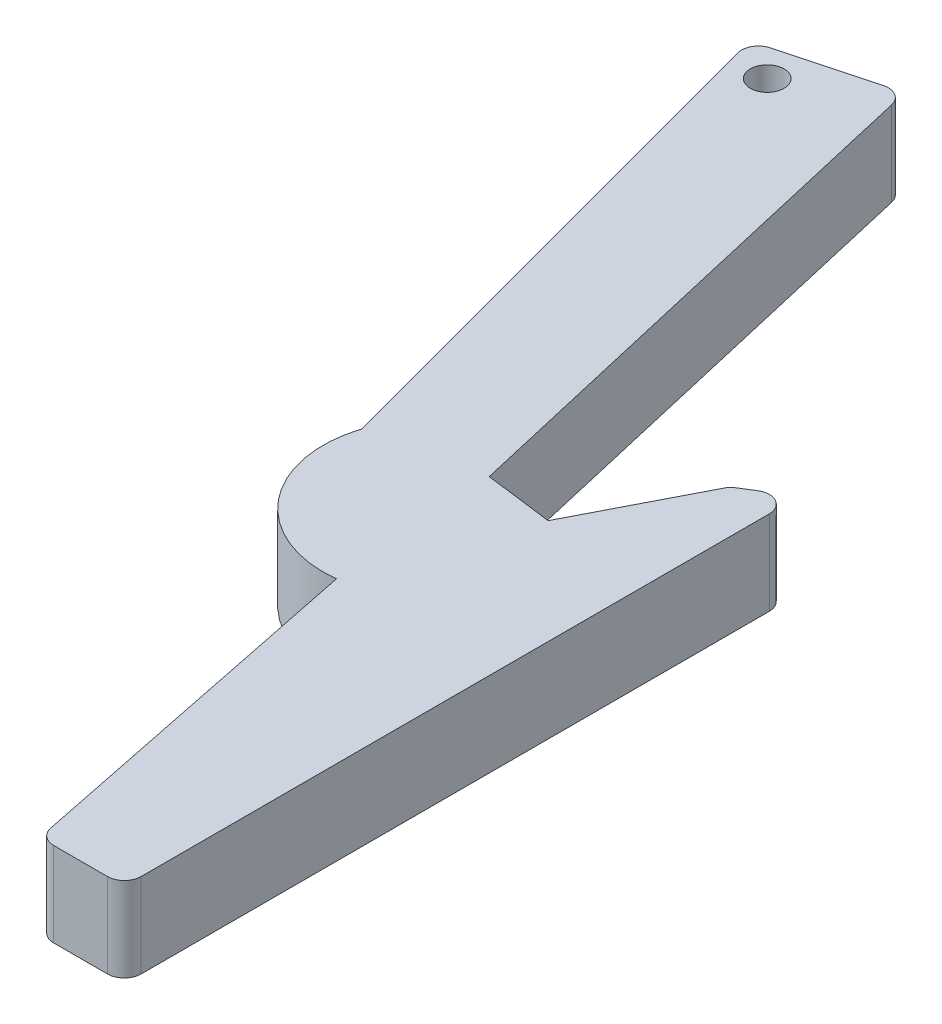
ISO-10303-21;
HEADER;
FILE_DESCRIPTION(('STEP AP214'),'2;1');
FILE_NAME('part.step','',(''),(''),'','','');
FILE_SCHEMA(('AUTOMOTIVE_DESIGN { 1 0 10303 214 1 1 1 1 }'));
ENDSEC;
DATA;
#1=APPLICATION_CONTEXT('core data for automotive mechanical design processes');
#2=APPLICATION_PROTOCOL_DEFINITION('international standard','automotive_design',2000,#1);
#3=PRODUCT_CONTEXT('',#1,'mechanical');
#4=PRODUCT('Part','Part','',(#3));
#5=PRODUCT_RELATED_PRODUCT_CATEGORY('part','',(#4));
#6=PRODUCT_DEFINITION_FORMATION('','',#4);
#7=PRODUCT_DEFINITION_CONTEXT('part definition',#1,'design');
#8=PRODUCT_DEFINITION('design','',#6,#7);
#9=PRODUCT_DEFINITION_SHAPE('','',#8);
#10=(LENGTH_UNIT() NAMED_UNIT(*) SI_UNIT(.MILLI.,.METRE.));
#11=(NAMED_UNIT(*) PLANE_ANGLE_UNIT() SI_UNIT($,.RADIAN.));
#12=(NAMED_UNIT(*) SI_UNIT($,.STERADIAN.) SOLID_ANGLE_UNIT());
#13=UNCERTAINTY_MEASURE_WITH_UNIT(LENGTH_MEASURE(1.E-05),#10,'distance_accuracy_value','');
#14=(GEOMETRIC_REPRESENTATION_CONTEXT(3) GLOBAL_UNCERTAINTY_ASSIGNED_CONTEXT((#13)) GLOBAL_UNIT_ASSIGNED_CONTEXT((#10,
#11,#12)) REPRESENTATION_CONTEXT('',''));
#15=CARTESIAN_POINT('',(0.,0.,0.));
#16=DIRECTION('',(0.,0.,1.));
#17=DIRECTION('',(1.,0.,0.));
#18=AXIS2_PLACEMENT_3D('',#15,#16,#17);
#19=CARTESIAN_POINT('',(8.37781457860772,9.,5.02999109124302));
#20=DIRECTION('',(-0.974370064785236,0.,0.224951054343863));
#21=DIRECTION('',(0.224951054343863,0.,0.974370064785236));
#22=AXIS2_PLACEMENT_3D('',#19,#20,#21);
#23=PLANE('',#22);
#24=DIRECTION('',(-0.224951054343863,0.,-0.974370064785236));
#25=VECTOR('',#24,1.);
#26=CARTESIAN_POINT('',(8.37781457860772,0.999999999999999,5.02999109124302));
#27=LINE('',#26,#25);
#28=CARTESIAN_POINT('',(20.1982659642364,0.999999999999999,56.229991091243));
#29=VERTEX_POINT('',#28);
#30=CARTESIAN_POINT('',(8.75052439603527,0.999999999999999,6.64437467353932));
#31=VERTEX_POINT('',#30);
#32=EDGE_CURVE('E212',#29,#31,#27,.T.);
#33=ORIENTED_EDGE('',*,*,#32,.T.);
#34=DIRECTION('',(0.,-1.,0.));
#35=VECTOR('',#34,1.);
#36=CARTESIAN_POINT('',(8.75052439603527,9.,6.64437467353932));
#37=LINE('',#36,#35);
#38=CARTESIAN_POINT('',(8.75052439603527,9.,6.64437467353932));
#39=VERTEX_POINT('',#38);
#40=EDGE_CURVE('E53',#31,#39,#37,.F.);
#41=ORIENTED_EDGE('',*,*,#40,.T.);
#42=DIRECTION('',(-0.224951054343863,0.,-0.974370064785236));
#43=VECTOR('',#42,1.);
#44=CARTESIAN_POINT('',(8.37781457860772,9.,5.02999109124302));
#45=LINE('',#44,#43);
#46=CARTESIAN_POINT('',(20.1982659642364,9.,56.229991091243));
#47=VERTEX_POINT('',#46);
#48=EDGE_CURVE('E247',#47,#39,#45,.T.);
#49=ORIENTED_EDGE('',*,*,#48,.F.);
#50=DIRECTION('',(0.,-1.,0.));
#51=VECTOR('',#50,1.);
#52=CARTESIAN_POINT('',(20.1982659642364,9.,56.229991091243));
#53=LINE('',#52,#51);
#54=EDGE_CURVE('E211',#47,#29,#53,.T.);
#55=ORIENTED_EDGE('',*,*,#54,.T.);
#56=EDGE_LOOP('',(#33,#41,#49,#55));
#57=FACE_BOUND('',#56,.T.);
#58=ADVANCED_FACE('F44',(#57),#23,.F.);
#59=CARTESIAN_POINT('',(8.37781457860772,9.,5.02999109124302));
#60=DIRECTION('',(0.258819045102515,0.,0.96592582628907));
#61=DIRECTION('',(0.96592582628907,0.,-0.258819045102515));
#62=AXIS2_PLACEMENT_3D('',#59,#60,#61);
#63=PLANE('',#62);
#64=DIRECTION('',(-0.96592582628907,0.,0.258819045102515));
#65=VECTOR('',#64,1.);
#66=CARTESIAN_POINT('',(8.37781457860772,9.,5.02999109124302));
#67=LINE('',#66,#65);
#68=CARTESIAN_POINT('',(6.77742182021487,9.,5.45881503842699));
#69=VERTEX_POINT('',#68);
#70=CARTESIAN_POINT('',(-1.66781401479859,9.,7.72170916030917));
#71=VERTEX_POINT('',#70);
#72=EDGE_CURVE('E172',#69,#71,#67,.T.);
#73=ORIENTED_EDGE('',*,*,#72,.F.);
#74=DIRECTION('',(0.,-1.,0.));
#75=VECTOR('',#74,1.);
#76=CARTESIAN_POINT('',(6.77742182021487,9.,5.45881503842699));
#77=LINE('',#76,#75);
#78=CARTESIAN_POINT('',(6.77742182021487,0.999999999999999,5.45881503842699));
#79=VERTEX_POINT('',#78);
#80=EDGE_CURVE('E320',#69,#79,#77,.T.);
#81=ORIENTED_EDGE('',*,*,#80,.T.);
#82=DIRECTION('',(-0.96592582628907,0.,0.258819045102515));
#83=VECTOR('',#82,1.);
#84=CARTESIAN_POINT('',(8.37781457860772,0.999999999999999,5.02999109124302));
#85=LINE('',#84,#83);
#86=CARTESIAN_POINT('',(-1.66781401479859,0.999999999999999,7.72170916030917));
#87=VERTEX_POINT('',#86);
#88=EDGE_CURVE('E216',#79,#87,#85,.T.);
#89=ORIENTED_EDGE('',*,*,#88,.T.);
#90=DIRECTION('',(0.,-1.,0.));
#91=VECTOR('',#90,1.);
#92=CARTESIAN_POINT('',(-1.6678140147986,9.,7.72170916030917));
#93=LINE('',#92,#91);
#94=EDGE_CURVE('E317',#87,#71,#93,.F.);
#95=ORIENTED_EDGE('',*,*,#94,.T.);
#96=EDGE_LOOP('',(#73,#81,#89,#95));
#97=FACE_BOUND('',#96,.T.);
#98=ADVANCED_FACE('F340',(#97),#63,.F.);
#99=CARTESIAN_POINT('',(-3.21329533686112,9.,8.1358196324732));
#100=DIRECTION('',(0.965925826289069,0.,-0.258819045102518));
#101=DIRECTION('',(-0.258819045102518,0.,-0.965925826289069));
#102=AXIS2_PLACEMENT_3D('',#99,#100,#101);
#103=PLANE('',#102);
#104=DIRECTION('',(0.258819045102518,0.,0.965925826289069));
#105=VECTOR('',#104,1.);
#106=CARTESIAN_POINT('',(-3.21329533686112,9.,8.1358196324732));
#107=LINE('',#106,#105);
#108=CARTESIAN_POINT('',(-2.79918486469708,9.,9.68130095453571));
#109=VERTEX_POINT('',#108);
#110=CARTESIAN_POINT('',(10.2452950084698,9.,58.3639625995048));
#111=VERTEX_POINT('',#110);
#112=EDGE_CURVE('E158',#109,#111,#107,.T.);
#113=ORIENTED_EDGE('',*,*,#112,.F.);
#114=DIRECTION('',(0.,-1.,0.));
#115=VECTOR('',#114,1.);
#116=CARTESIAN_POINT('',(-2.79918486469708,9.,9.68130095453571));
#117=LINE('',#116,#115);
#118=CARTESIAN_POINT('',(-2.79918486469708,0.999999999999999,9.68130095453571));
#119=VERTEX_POINT('',#118);
#120=EDGE_CURVE('E11',#109,#119,#117,.T.);
#121=ORIENTED_EDGE('',*,*,#120,.T.);
#122=DIRECTION('',(0.258819045102518,0.,0.965925826289069));
#123=VECTOR('',#122,1.);
#124=CARTESIAN_POINT('',(-3.21329533686112,0.999999999999999,8.1358196324732));
#125=LINE('',#124,#123);
#126=CARTESIAN_POINT('',(10.2452950084698,0.999999999999999,58.3639625995048));
#127=VERTEX_POINT('',#126);
#128=EDGE_CURVE('E178',#119,#127,#125,.T.);
#129=ORIENTED_EDGE('',*,*,#128,.T.);
#130=DIRECTION('',(0.,-1.,0.));
#131=VECTOR('',#130,1.);
#132=CARTESIAN_POINT('',(10.2452950084698,9.,58.3639625995048));
#133=LINE('',#132,#131);
#134=EDGE_CURVE('E175',#111,#127,#133,.T.);
#135=ORIENTED_EDGE('',*,*,#134,.F.);
#136=EDGE_LOOP('',(#113,#121,#129,#135));
#137=FACE_BOUND('',#136,.T.);
#138=ADVANCED_FACE('F176',(#137),#103,.F.);
#139=CARTESIAN_POINT('',(20.1531179591072,9.,61.5254566100675));
#140=DIRECTION('',(0.,-1.,0.));
#141=DIRECTION('',(0.,0.,-1.));
#142=AXIS2_PLACEMENT_3D('',#139,#140,#141);
#143=CYLINDRICAL_SURFACE('',#142,10.4);
#144=CARTESIAN_POINT('',(20.1531179591072,0.999999999999999,61.5254566100675));
#145=DIRECTION('',(0.,1.,0.));
#146=DIRECTION('',(0.,0.,-1.));
#147=AXIS2_PLACEMENT_3D('',#144,#145,#146);
#148=CIRCLE('',#147,10.4);
#149=CARTESIAN_POINT('',(21.3482652086114,0.999999999999999,71.8565564088305));
#150=VERTEX_POINT('',#149);
#151=EDGE_CURVE('E223',#127,#150,#148,.T.);
#152=ORIENTED_EDGE('',*,*,#151,.T.);
#153=DIRECTION('',(0.,-1.,0.));
#154=VECTOR('',#153,1.);
#155=CARTESIAN_POINT('',(21.3482652086114,9.,71.8565564088305));
#156=LINE('',#155,#154);
#157=CARTESIAN_POINT('',(21.3482652086114,9.,71.8565564088305));
#158=VERTEX_POINT('',#157);
#159=EDGE_CURVE('E183',#158,#150,#156,.T.);
#160=ORIENTED_EDGE('',*,*,#159,.F.);
#161=CARTESIAN_POINT('',(20.1531179591072,9.,61.5254566100675));
#162=DIRECTION('',(0.,1.,0.));
#163=DIRECTION('',(0.,0.,-1.));
#164=AXIS2_PLACEMENT_3D('',#161,#162,#163);
#165=CIRCLE('',#164,10.4);
#166=EDGE_CURVE('E164',#111,#158,#165,.T.);
#167=ORIENTED_EDGE('',*,*,#166,.F.);
#168=ORIENTED_EDGE('',*,*,#134,.T.);
#169=EDGE_LOOP('',(#152,#160,#167,#168));
#170=FACE_BOUND('',#169,.T.);
#171=ADVANCED_FACE('F185',(#170),#143,.T.);
#172=CARTESIAN_POINT('',(28.5240618902567,9.,107.134140537902));
#173=DIRECTION('',(0.979932892474197,0.,-0.199327685601258));
#174=DIRECTION('',(-0.199327685601258,0.,-0.979932892474197));
#175=AXIS2_PLACEMENT_3D('',#172,#173,#174);
#176=PLANE('',#175);
#177=DIRECTION('',(0.199327685601258,0.,0.979932892474197));
#178=VECTOR('',#177,1.);
#179=CARTESIAN_POINT('',(28.5240618902567,0.999999999999999,107.134140537902));
#180=LINE('',#179,#178);
#181=CARTESIAN_POINT('',(28.2634788881678,0.999999999999999,105.853064834864));
#182=VERTEX_POINT('',#181);
#183=EDGE_CURVE('E226',#150,#182,#180,.T.);
#184=ORIENTED_EDGE('',*,*,#183,.T.);
#185=DIRECTION('',(0.,-1.,0.));
#186=VECTOR('',#185,1.);
#187=CARTESIAN_POINT('',(28.2634788881678,9.,105.853064834864));
#188=LINE('',#187,#186);
#189=CARTESIAN_POINT('',(28.2634788881678,9.,105.853064834864));
#190=VERTEX_POINT('',#189);
#191=EDGE_CURVE('E304',#182,#190,#188,.F.);
#192=ORIENTED_EDGE('',*,*,#191,.T.);
#193=DIRECTION('',(0.199327685601258,0.,0.979932892474197));
#194=VECTOR('',#193,1.);
#195=CARTESIAN_POINT('',(28.5240618902567,9.,107.134140537902));
#196=LINE('',#195,#194);
#197=EDGE_CURVE('E189',#158,#190,#196,.T.);
#198=ORIENTED_EDGE('',*,*,#197,.F.);
#199=ORIENTED_EDGE('',*,*,#159,.T.);
#200=EDGE_LOOP('',(#184,#192,#198,#199));
#201=FACE_BOUND('',#200,.T.);
#202=ADVANCED_FACE('F444',(#201),#176,.F.);
#203=CARTESIAN_POINT('',(36.5240618902567,9.,107.134140537902));
#204=DIRECTION('',(0.,0.,-1.));
#205=DIRECTION('',(-1.,0.,0.));
#206=AXIS2_PLACEMENT_3D('',#203,#204,#205);
#207=PLANE('',#206);
#208=DIRECTION('',(1.,0.,0.));
#209=VECTOR('',#208,1.);
#210=CARTESIAN_POINT('',(36.5240618902567,0.999999999999999,107.134140537902));
#211=LINE('',#210,#209);
#212=CARTESIAN_POINT('',(29.8313715161265,0.999999999999999,107.134140537902));
#213=VERTEX_POINT('',#212);
#214=CARTESIAN_POINT('',(34.9240618902567,0.999999999999999,107.134140537902));
#215=VERTEX_POINT('',#214);
#216=EDGE_CURVE('E230',#213,#215,#211,.T.);
#217=ORIENTED_EDGE('',*,*,#216,.T.);
#218=DIRECTION('',(0.,-1.,0.));
#219=VECTOR('',#218,1.);
#220=CARTESIAN_POINT('',(34.9240618902567,9.,107.134140537902));
#221=LINE('',#220,#219);
#222=CARTESIAN_POINT('',(34.9240618902567,9.,107.134140537902));
#223=VERTEX_POINT('',#222);
#224=EDGE_CURVE('E285',#215,#223,#221,.F.);
#225=ORIENTED_EDGE('',*,*,#224,.T.);
#226=DIRECTION('',(1.,0.,0.));
#227=VECTOR('',#226,1.);
#228=CARTESIAN_POINT('',(36.5240618902567,9.,107.134140537902));
#229=LINE('',#228,#227);
#230=CARTESIAN_POINT('',(29.8313715161265,9.,107.134140537902));
#231=VERTEX_POINT('',#230);
#232=EDGE_CURVE('E192',#231,#223,#229,.T.);
#233=ORIENTED_EDGE('',*,*,#232,.F.);
#234=DIRECTION('',(0.,-1.,0.));
#235=VECTOR('',#234,1.);
#236=CARTESIAN_POINT('',(29.8313715161265,9.,107.134140537902));
#237=LINE('',#236,#235);
#238=EDGE_CURVE('E281',#231,#213,#237,.T.);
#239=ORIENTED_EDGE('',*,*,#238,.T.);
#240=EDGE_LOOP('',(#217,#225,#233,#239));
#241=FACE_BOUND('',#240,.T.);
#242=ADVANCED_FACE('F434',(#241),#207,.F.);
#243=CARTESIAN_POINT('',(36.5240618902567,9.,43.1341405379016));
#244=DIRECTION('',(-1.,0.,0.));
#245=DIRECTION('',(0.,0.,1.));
#246=AXIS2_PLACEMENT_3D('',#243,#244,#245);
#247=PLANE('',#246);
#248=DIRECTION('',(0.,0.,-1.));
#249=VECTOR('',#248,1.);
#250=CARTESIAN_POINT('',(36.5240618902567,9.,43.1341405379016));
#251=LINE('',#250,#249);
#252=CARTESIAN_POINT('',(36.5240618902567,9.,105.534140537902));
#253=VERTEX_POINT('',#252);
#254=CARTESIAN_POINT('',(36.5240618902567,9.,46.0184373430169));
#255=VERTEX_POINT('',#254);
#256=EDGE_CURVE('E198',#253,#255,#251,.T.);
#257=ORIENTED_EDGE('',*,*,#256,.F.);
#258=DIRECTION('',(0.,-1.,0.));
#259=VECTOR('',#258,1.);
#260=CARTESIAN_POINT('',(36.5240618902567,9.,105.534140537902));
#261=LINE('',#260,#259);
#262=CARTESIAN_POINT('',(36.5240618902567,0.999999999999999,105.534140537902));
#263=VERTEX_POINT('',#262);
#264=EDGE_CURVE('E259',#253,#263,#261,.T.);
#265=ORIENTED_EDGE('',*,*,#264,.T.);
#266=DIRECTION('',(0.,0.,-1.));
#267=VECTOR('',#266,1.);
#268=CARTESIAN_POINT('',(36.5240618902567,0.999999999999999,43.1341405379016));
#269=LINE('',#268,#267);
#270=CARTESIAN_POINT('',(36.5240618902567,0.999999999999999,46.0184373430169));
#271=VERTEX_POINT('',#270);
#272=EDGE_CURVE('E234',#263,#271,#269,.T.);
#273=ORIENTED_EDGE('',*,*,#272,.T.);
#274=DIRECTION('',(0.,-1.,0.));
#275=VECTOR('',#274,1.);
#276=CARTESIAN_POINT('',(36.5240618902567,9.,46.0184373430169));
#277=LINE('',#276,#275);
#278=EDGE_CURVE('E182',#271,#255,#277,.F.);
#279=ORIENTED_EDGE('',*,*,#278,.T.);
#280=EDGE_LOOP('',(#257,#265,#273,#279));
#281=FACE_BOUND('',#280,.T.);
#282=ADVANCED_FACE('F425',(#281),#247,.F.);
#283=CARTESIAN_POINT('',(32.4518020738587,9.,45.6751442741741));
#284=DIRECTION('',(0.529375778390093,0.,0.848387461749573));
#285=DIRECTION('',(0.848387461749573,0.,-0.529375778390093));
#286=AXIS2_PLACEMENT_3D('',#283,#284,#285);
#287=PLANE('',#286);
#288=DIRECTION('',(-0.848387461749573,0.,0.529375778390093));
#289=VECTOR('',#288,1.);
#290=CARTESIAN_POINT('',(32.4518020738587,9.,45.6751442741741));
#291=LINE('',#290,#289);
#292=CARTESIAN_POINT('',(34.0770606448325,9.,44.6610174042176));
#293=VERTEX_POINT('',#292);
#294=CARTESIAN_POINT('',(32.8259936292899,9.,45.4416566817067));
#295=VERTEX_POINT('',#294);
#296=EDGE_CURVE('E202',#293,#295,#291,.T.);
#297=ORIENTED_EDGE('',*,*,#296,.F.);
#298=DIRECTION('',(0.,-1.,0.));
#299=VECTOR('',#298,1.);
#300=CARTESIAN_POINT('',(34.0770606448325,9.,44.6610174042176));
#301=LINE('',#300,#299);
#302=CARTESIAN_POINT('',(34.0770606448325,0.999999999999999,44.6610174042176));
#303=VERTEX_POINT('',#302);
#304=EDGE_CURVE('E309',#293,#303,#301,.T.);
#305=ORIENTED_EDGE('',*,*,#304,.T.);
#306=DIRECTION('',(-0.848387461749573,0.,0.529375778390093));
#307=VECTOR('',#306,1.);
#308=CARTESIAN_POINT('',(32.4518020738587,0.999999999999999,45.6751442741741));
#309=LINE('',#308,#307);
#310=CARTESIAN_POINT('',(32.8259936292899,0.999999999999999,45.4416566817067));
#311=VERTEX_POINT('',#310);
#312=EDGE_CURVE('E238',#303,#311,#309,.T.);
#313=ORIENTED_EDGE('',*,*,#312,.T.);
#314=DIRECTION('',(0.,-1.,0.));
#315=VECTOR('',#314,1.);
#316=CARTESIAN_POINT('',(32.8259936292899,9.,45.4416566817067));
#317=LINE('',#316,#315);
#318=EDGE_CURVE('E68',#311,#295,#317,.F.);
#319=ORIENTED_EDGE('',*,*,#318,.T.);
#320=EDGE_LOOP('',(#297,#305,#313,#319));
#321=FACE_BOUND('',#320,.T.);
#322=ADVANCED_FACE('F415',(#321),#287,.F.);
#323=CARTESIAN_POINT('',(26.5982659642364,9.,57.0582947613348));
#324=DIRECTION('',(0.889308631809432,0.,0.457307508564243));
#325=DIRECTION('',(0.457307508564243,0.,-0.889308631809432));
#326=AXIS2_PLACEMENT_3D('',#323,#324,#325);
#327=PLANE('',#326);
#328=DIRECTION('',(-0.457307508564243,0.,0.889308631809432));
#329=VECTOR('',#328,1.);
#330=CARTESIAN_POINT('',(26.5982659642364,9.,57.0582947613348));
#331=LINE('',#330,#329);
#332=CARTESIAN_POINT('',(32.2501010638189,9.,46.0673846068033));
#333=VERTEX_POINT('',#332);
#334=CARTESIAN_POINT('',(26.5982659642364,9.,57.0582947613348));
#335=VERTEX_POINT('',#334);
#336=EDGE_CURVE('E205',#333,#335,#331,.T.);
#337=ORIENTED_EDGE('',*,*,#336,.F.);
#338=DIRECTION('',(0.,-1.,0.));
#339=VECTOR('',#338,1.);
#340=CARTESIAN_POINT('',(32.2501010638189,9.,46.0673846068033));
#341=LINE('',#340,#339);
#342=CARTESIAN_POINT('',(32.2501010638189,0.999999999999999,46.0673846068033));
#343=VERTEX_POINT('',#342);
#344=EDGE_CURVE('E313',#333,#343,#341,.T.);
#345=ORIENTED_EDGE('',*,*,#344,.T.);
#346=DIRECTION('',(-0.457307508564243,0.,0.889308631809432));
#347=VECTOR('',#346,1.);
#348=CARTESIAN_POINT('',(26.5982659642364,0.999999999999999,57.0582947613348));
#349=LINE('',#348,#347);
#350=CARTESIAN_POINT('',(26.5982659642364,0.999999999999999,57.0582947613348));
#351=VERTEX_POINT('',#350);
#352=EDGE_CURVE('E241',#343,#351,#349,.T.);
#353=ORIENTED_EDGE('',*,*,#352,.T.);
#354=DIRECTION('',(0.,-1.,0.));
#355=VECTOR('',#354,1.);
#356=CARTESIAN_POINT('',(26.5982659642364,9.,57.0582947613348));
#357=LINE('',#356,#355);
#358=EDGE_CURVE('E251',#335,#351,#357,.T.);
#359=ORIENTED_EDGE('',*,*,#358,.F.);
#360=EDGE_LOOP('',(#337,#345,#353,#359));
#361=FACE_BOUND('',#360,.T.);
#362=ADVANCED_FACE('F372',(#361),#327,.F.);
#363=CARTESIAN_POINT('',(20.1982659642364,9.,56.229991091243));
#364=DIRECTION('',(-0.128351954041154,0.,0.991728680584472));
#365=DIRECTION('',(0.991728680584472,0.,0.128351954041154));
#366=AXIS2_PLACEMENT_3D('',#363,#364,#365);
#367=PLANE('',#366);
#368=DIRECTION('',(-0.991728680584472,0.,-0.128351954041154));
#369=VECTOR('',#368,1.);
#370=CARTESIAN_POINT('',(20.1982659642364,0.999999999999999,56.229991091243));
#371=LINE('',#370,#369);
#372=EDGE_CURVE('E244',#351,#29,#371,.T.);
#373=ORIENTED_EDGE('',*,*,#372,.T.);
#374=ORIENTED_EDGE('',*,*,#54,.F.);
#375=DIRECTION('',(-0.991728680584472,0.,-0.128351954041154));
#376=VECTOR('',#375,1.);
#377=CARTESIAN_POINT('',(20.1982659642364,9.,56.229991091243));
#378=LINE('',#377,#376);
#379=EDGE_CURVE('E208',#335,#47,#378,.T.);
#380=ORIENTED_EDGE('',*,*,#379,.F.);
#381=ORIENTED_EDGE('',*,*,#358,.T.);
#382=EDGE_LOOP('',(#373,#374,#380,#381));
#383=FACE_BOUND('',#382,.T.);
#384=ADVANCED_FACE('F365',(#383),#367,.F.);
#385=CARTESIAN_POINT('',(20.1531179591072,9.,61.5254566100675));
#386=DIRECTION('',(0.,-1.,0.));
#387=DIRECTION('',(0.,0.,-1.));
#388=AXIS2_PLACEMENT_3D('',#385,#386,#387);
#389=PLANE('',#388);
#390=CARTESIAN_POINT('',(0.705888251591967,9.,10.3985613322702));
#391=DIRECTION('',(0.,1.,0.));
#392=DIRECTION('',(0.,0.,1.));
#393=AXIS2_PLACEMENT_3D('',#390,#391,#392);
#394=CIRCLE('',#393,1.6);
#395=CARTESIAN_POINT('',(0.705888251591967,9.,11.9985613322702));
#396=VERTEX_POINT('',#395);
#397=EDGE_CURVE('E348',#396,#396,#394,.T.);
#398=ORIENTED_EDGE('',*,*,#397,.F.);
#399=EDGE_LOOP('',(#398));
#400=FACE_BOUND('',#399,.T.);
#401=ORIENTED_EDGE('',*,*,#232,.T.);
#402=CARTESIAN_POINT('',(34.9240618902567,9.,105.534140537902));
#403=DIRECTION('',(0.,-1.,0.));
#404=DIRECTION('',(0.,0.,-1.));
#405=AXIS2_PLACEMENT_3D('',#402,#403,#404);
#406=CIRCLE('',#405,1.6);
#407=EDGE_CURVE('E301',#223,#253,#406,.F.);
#408=ORIENTED_EDGE('',*,*,#407,.T.);
#409=ORIENTED_EDGE('',*,*,#256,.T.);
#410=CARTESIAN_POINT('',(34.9240618902567,9.,46.0184373430169));
#411=DIRECTION('',(0.,-1.,0.));
#412=DIRECTION('',(0.,0.,-1.));
#413=AXIS2_PLACEMENT_3D('',#410,#411,#412);
#414=CIRCLE('',#413,1.6);
#415=EDGE_CURVE('E295',#255,#293,#414,.F.);
#416=ORIENTED_EDGE('',*,*,#415,.T.);
#417=ORIENTED_EDGE('',*,*,#296,.T.);
#418=CARTESIAN_POINT('',(33.672994874714,9.,46.7990766205061));
#419=DIRECTION('',(0.,-1.,0.));
#420=DIRECTION('',(0.,0.,-1.));
#421=AXIS2_PLACEMENT_3D('',#418,#419,#420);
#422=CIRCLE('',#421,1.6);
#423=EDGE_CURVE('E60',#295,#333,#422,.F.);
#424=ORIENTED_EDGE('',*,*,#423,.T.);
#425=ORIENTED_EDGE('',*,*,#336,.T.);
#426=ORIENTED_EDGE('',*,*,#379,.T.);
#427=ORIENTED_EDGE('',*,*,#48,.T.);
#428=CARTESIAN_POINT('',(7.19153229237889,9.,7.0042963604895));
#429=DIRECTION('',(0.,-1.,0.));
#430=DIRECTION('',(0.,0.,-1.));
#431=AXIS2_PLACEMENT_3D('',#428,#429,#430);
#432=CIRCLE('',#431,1.6);
#433=EDGE_CURVE('E290',#39,#69,#432,.F.);
#434=ORIENTED_EDGE('',*,*,#433,.T.);
#435=ORIENTED_EDGE('',*,*,#72,.T.);
#436=CARTESIAN_POINT('',(-1.25370354263457,9.,9.26719048237168));
#437=DIRECTION('',(0.,-1.,0.));
#438=DIRECTION('',(0.,0.,-1.));
#439=AXIS2_PLACEMENT_3D('',#436,#437,#438);
#440=CIRCLE('',#439,1.6);
#441=EDGE_CURVE('E168',#71,#109,#440,.F.);
#442=ORIENTED_EDGE('',*,*,#441,.T.);
#443=ORIENTED_EDGE('',*,*,#112,.T.);
#444=ORIENTED_EDGE('',*,*,#166,.T.);
#445=ORIENTED_EDGE('',*,*,#197,.T.);
#446=CARTESIAN_POINT('',(29.8313715161265,9.,105.534140537902));
#447=DIRECTION('',(0.,-1.,0.));
#448=DIRECTION('',(0.,0.,-1.));
#449=AXIS2_PLACEMENT_3D('',#446,#447,#448);
#450=CIRCLE('',#449,1.6);
#451=EDGE_CURVE('E298',#190,#231,#450,.F.);
#452=ORIENTED_EDGE('',*,*,#451,.T.);
#453=EDGE_LOOP('',(#401,#408,#409,#416,#417,#424,#425,#426,#427,#434,#435,#442,#443,#444,#445,#452));
#454=FACE_BOUND('',#453,.T.);
#455=ADVANCED_FACE('F161',(#400,#454),#389,.F.);
#456=CARTESIAN_POINT('',(20.1531179591072,0.999999999999999,61.5254566100675));
#457=DIRECTION('',(0.,-1.,0.));
#458=DIRECTION('',(0.,0.,-1.));
#459=AXIS2_PLACEMENT_3D('',#456,#457,#458);
#460=PLANE('',#459);
#461=CARTESIAN_POINT('',(0.705888251591967,0.999999999999999,10.3985613322702));
#462=DIRECTION('',(0.,1.,0.));
#463=DIRECTION('',(0.,0.,1.));
#464=AXIS2_PLACEMENT_3D('',#461,#462,#463);
#465=CIRCLE('',#464,1.6);
#466=CARTESIAN_POINT('',(0.705888251591967,0.999999999999999,11.9985613322702));
#467=VERTEX_POINT('',#466);
#468=EDGE_CURVE('E217',#467,#467,#465,.T.);
#469=ORIENTED_EDGE('',*,*,#468,.T.);
#470=EDGE_LOOP('',(#469));
#471=FACE_BOUND('',#470,.T.);
#472=ORIENTED_EDGE('',*,*,#272,.F.);
#473=CARTESIAN_POINT('',(34.9240618902567,0.999999999999999,105.534140537902));
#474=DIRECTION('',(0.,-1.,0.));
#475=DIRECTION('',(0.,0.,-1.));
#476=AXIS2_PLACEMENT_3D('',#473,#474,#475);
#477=CIRCLE('',#476,1.6);
#478=EDGE_CURVE('E278',#263,#215,#477,.T.);
#479=ORIENTED_EDGE('',*,*,#478,.T.);
#480=ORIENTED_EDGE('',*,*,#216,.F.);
#481=CARTESIAN_POINT('',(29.8313715161265,0.999999999999999,105.534140537902));
#482=DIRECTION('',(0.,-1.,0.));
#483=DIRECTION('',(0.,0.,-1.));
#484=AXIS2_PLACEMENT_3D('',#481,#482,#483);
#485=CIRCLE('',#484,1.6);
#486=EDGE_CURVE('E275',#213,#182,#485,.T.);
#487=ORIENTED_EDGE('',*,*,#486,.T.);
#488=ORIENTED_EDGE('',*,*,#183,.F.);
#489=ORIENTED_EDGE('',*,*,#151,.F.);
#490=ORIENTED_EDGE('',*,*,#128,.F.);
#491=CARTESIAN_POINT('',(-1.25370354263457,0.999999999999999,9.26719048237168));
#492=DIRECTION('',(0.,-1.,0.));
#493=DIRECTION('',(0.,0.,-1.));
#494=AXIS2_PLACEMENT_3D('',#491,#492,#493);
#495=CIRCLE('',#494,1.6);
#496=EDGE_CURVE('E263',#119,#87,#495,.T.);
#497=ORIENTED_EDGE('',*,*,#496,.T.);
#498=ORIENTED_EDGE('',*,*,#88,.F.);
#499=CARTESIAN_POINT('',(7.19153229237889,0.999999999999999,7.0042963604895));
#500=DIRECTION('',(0.,-1.,0.));
#501=DIRECTION('',(0.,0.,-1.));
#502=AXIS2_PLACEMENT_3D('',#499,#500,#501);
#503=CIRCLE('',#502,1.6);
#504=EDGE_CURVE('E266',#79,#31,#503,.T.);
#505=ORIENTED_EDGE('',*,*,#504,.T.);
#506=ORIENTED_EDGE('',*,*,#32,.F.);
#507=ORIENTED_EDGE('',*,*,#372,.F.);
#508=ORIENTED_EDGE('',*,*,#352,.F.);
#509=CARTESIAN_POINT('',(33.672994874714,0.999999999999999,46.7990766205061));
#510=DIRECTION('',(0.,-1.,0.));
#511=DIRECTION('',(0.,0.,-1.));
#512=AXIS2_PLACEMENT_3D('',#509,#510,#511);
#513=CIRCLE('',#512,1.6);
#514=EDGE_CURVE('E269',#343,#311,#513,.T.);
#515=ORIENTED_EDGE('',*,*,#514,.T.);
#516=ORIENTED_EDGE('',*,*,#312,.F.);
#517=CARTESIAN_POINT('',(34.9240618902567,0.999999999999999,46.0184373430169));
#518=DIRECTION('',(0.,-1.,0.));
#519=DIRECTION('',(0.,0.,-1.));
#520=AXIS2_PLACEMENT_3D('',#517,#518,#519);
#521=CIRCLE('',#520,1.6);
#522=EDGE_CURVE('E272',#303,#271,#521,.T.);
#523=ORIENTED_EDGE('',*,*,#522,.T.);
#524=EDGE_LOOP('',(#472,#479,#480,#487,#488,#489,#490,#497,#498,#505,#506,#507,#508,#515,#516,#523));
#525=FACE_BOUND('',#524,.T.);
#526=ADVANCED_FACE('F344',(#471,#525),#460,.T.);
#527=CARTESIAN_POINT('',(0.705888251591967,0.999999999999999,10.3985613322702));
#528=DIRECTION('',(0.,1.,0.));
#529=DIRECTION('',(0.,0.,1.));
#530=AXIS2_PLACEMENT_3D('',#527,#528,#529);
#531=CYLINDRICAL_SURFACE('',#530,1.6);
#532=ORIENTED_EDGE('',*,*,#468,.F.);
#533=EDGE_LOOP('',(#532));
#534=FACE_BOUND('',#533,.T.);
#535=ORIENTED_EDGE('',*,*,#397,.T.);
#536=EDGE_LOOP('',(#535));
#537=FACE_BOUND('',#536,.T.);
#538=ADVANCED_FACE('F357',(#534,#537),#531,.F.);
#539=CARTESIAN_POINT('',(34.9240618902567,9.,105.534140537902));
#540=DIRECTION('',(0.,-1.,0.));
#541=DIRECTION('',(0.,0.,-1.));
#542=AXIS2_PLACEMENT_3D('',#539,#540,#541);
#543=CYLINDRICAL_SURFACE('',#542,1.6);
#544=ORIENTED_EDGE('',*,*,#407,.F.);
#545=ORIENTED_EDGE('',*,*,#224,.F.);
#546=ORIENTED_EDGE('',*,*,#478,.F.);
#547=ORIENTED_EDGE('',*,*,#264,.F.);
#548=EDGE_LOOP('',(#544,#545,#546,#547));
#549=FACE_BOUND('',#548,.T.);
#550=ADVANCED_FACE('F360',(#549),#543,.T.);
#551=CARTESIAN_POINT('',(29.8313715161265,9.,105.534140537902));
#552=DIRECTION('',(0.,-1.,0.));
#553=DIRECTION('',(0.,0.,-1.));
#554=AXIS2_PLACEMENT_3D('',#551,#552,#553);
#555=CYLINDRICAL_SURFACE('',#554,1.6);
#556=ORIENTED_EDGE('',*,*,#451,.F.);
#557=ORIENTED_EDGE('',*,*,#191,.F.);
#558=ORIENTED_EDGE('',*,*,#486,.F.);
#559=ORIENTED_EDGE('',*,*,#238,.F.);
#560=EDGE_LOOP('',(#556,#557,#558,#559));
#561=FACE_BOUND('',#560,.T.);
#562=ADVANCED_FACE('F385',(#561),#555,.T.);
#563=CARTESIAN_POINT('',(34.9240618902567,9.,46.0184373430169));
#564=DIRECTION('',(0.,-1.,0.));
#565=DIRECTION('',(0.,0.,-1.));
#566=AXIS2_PLACEMENT_3D('',#563,#564,#565);
#567=CYLINDRICAL_SURFACE('',#566,1.6);
#568=ORIENTED_EDGE('',*,*,#415,.F.);
#569=ORIENTED_EDGE('',*,*,#278,.F.);
#570=ORIENTED_EDGE('',*,*,#522,.F.);
#571=ORIENTED_EDGE('',*,*,#304,.F.);
#572=EDGE_LOOP('',(#568,#569,#570,#571));
#573=FACE_BOUND('',#572,.T.);
#574=ADVANCED_FACE('F389',(#573),#567,.T.);
#575=CARTESIAN_POINT('',(33.672994874714,9.,46.7990766205061));
#576=DIRECTION('',(0.,-1.,0.));
#577=DIRECTION('',(0.,0.,-1.));
#578=AXIS2_PLACEMENT_3D('',#575,#576,#577);
#579=CYLINDRICAL_SURFACE('',#578,1.6);
#580=ORIENTED_EDGE('',*,*,#423,.F.);
#581=ORIENTED_EDGE('',*,*,#318,.F.);
#582=ORIENTED_EDGE('',*,*,#514,.F.);
#583=ORIENTED_EDGE('',*,*,#344,.F.);
#584=EDGE_LOOP('',(#580,#581,#582,#583));
#585=FACE_BOUND('',#584,.T.);
#586=ADVANCED_FACE('F393',(#585),#579,.T.);
#587=CARTESIAN_POINT('',(7.19153229237889,9.,7.0042963604895));
#588=DIRECTION('',(0.,-1.,0.));
#589=DIRECTION('',(0.,0.,-1.));
#590=AXIS2_PLACEMENT_3D('',#587,#588,#589);
#591=CYLINDRICAL_SURFACE('',#590,1.6);
#592=ORIENTED_EDGE('',*,*,#433,.F.);
#593=ORIENTED_EDGE('',*,*,#40,.F.);
#594=ORIENTED_EDGE('',*,*,#504,.F.);
#595=ORIENTED_EDGE('',*,*,#80,.F.);
#596=EDGE_LOOP('',(#592,#593,#594,#595));
#597=FACE_BOUND('',#596,.T.);
#598=ADVANCED_FACE('F337',(#597),#591,.T.);
#599=CARTESIAN_POINT('',(-1.25370354263457,9.,9.26719048237168));
#600=DIRECTION('',(0.,-1.,0.));
#601=DIRECTION('',(0.,0.,-1.));
#602=AXIS2_PLACEMENT_3D('',#599,#600,#601);
#603=CYLINDRICAL_SURFACE('',#602,1.6);
#604=ORIENTED_EDGE('',*,*,#441,.F.);
#605=ORIENTED_EDGE('',*,*,#94,.F.);
#606=ORIENTED_EDGE('',*,*,#496,.F.);
#607=ORIENTED_EDGE('',*,*,#120,.F.);
#608=EDGE_LOOP('',(#604,#605,#606,#607));
#609=FACE_BOUND('',#608,.T.);
#610=ADVANCED_FACE('F46',(#609),#603,.T.);
#611=CLOSED_SHELL('',(#58,#98,#138,#171,#202,#242,#282,#322,#362,#384,#455,#526,#538,#550,#562,
#574,#586,#598,#610));
#612=MANIFOLD_SOLID_BREP('B2',#611);
#613=ADVANCED_BREP_SHAPE_REPRESENTATION('',(#18,#612),#14);
#614=SHAPE_DEFINITION_REPRESENTATION(#9,#613);
ENDSEC;
END-ISO-10303-21;
